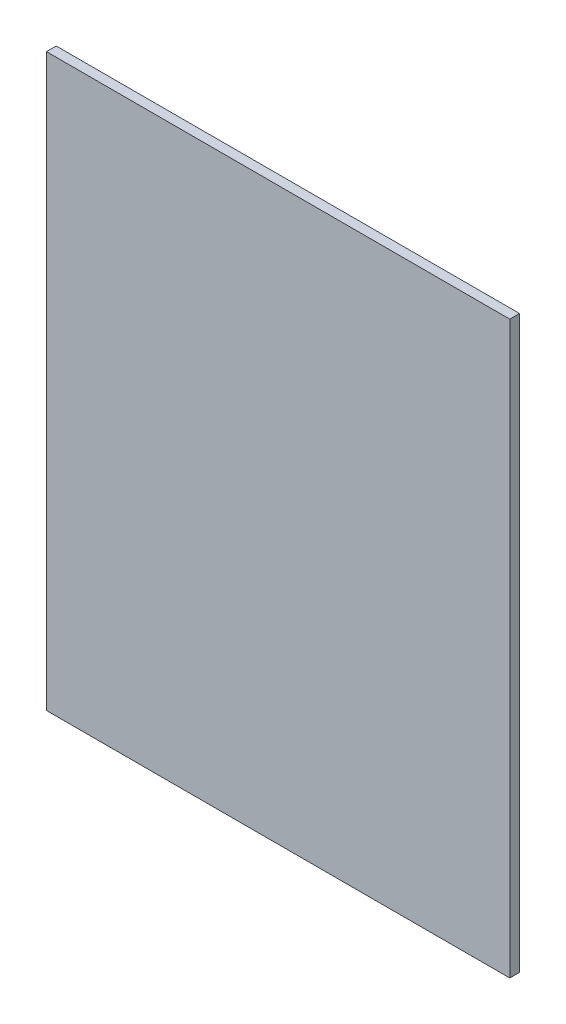
ISO-10303-21;
HEADER;
FILE_DESCRIPTION(('STEP AP214'),'2;1');
FILE_NAME('part.step','',(''),(''),'','','');
FILE_SCHEMA(('AUTOMOTIVE_DESIGN { 1 0 10303 214 1 1 1 1 }'));
ENDSEC;
DATA;
#1=APPLICATION_CONTEXT('core data for automotive mechanical design processes');
#2=APPLICATION_PROTOCOL_DEFINITION('international standard','automotive_design',2000,#1);
#3=PRODUCT_CONTEXT('',#1,'mechanical');
#4=PRODUCT('Part','Part','',(#3));
#5=PRODUCT_RELATED_PRODUCT_CATEGORY('part','',(#4));
#6=PRODUCT_DEFINITION_FORMATION('','',#4);
#7=PRODUCT_DEFINITION_CONTEXT('part definition',#1,'design');
#8=PRODUCT_DEFINITION('design','',#6,#7);
#9=PRODUCT_DEFINITION_SHAPE('','',#8);
#10=(LENGTH_UNIT() NAMED_UNIT(*) SI_UNIT(.MILLI.,.METRE.));
#11=(NAMED_UNIT(*) PLANE_ANGLE_UNIT() SI_UNIT($,.RADIAN.));
#12=(NAMED_UNIT(*) SI_UNIT($,.STERADIAN.) SOLID_ANGLE_UNIT());
#13=UNCERTAINTY_MEASURE_WITH_UNIT(LENGTH_MEASURE(1.E-05),#10,'distance_accuracy_value','');
#14=(GEOMETRIC_REPRESENTATION_CONTEXT(3) GLOBAL_UNCERTAINTY_ASSIGNED_CONTEXT((#13)) GLOBAL_UNIT_ASSIGNED_CONTEXT((#10,
#11,#12)) REPRESENTATION_CONTEXT('',''));
#15=CARTESIAN_POINT('',(0.,0.,0.));
#16=DIRECTION('',(0.,0.,1.));
#17=DIRECTION('',(1.,0.,0.));
#18=AXIS2_PLACEMENT_3D('',#15,#16,#17);
#19=CARTESIAN_POINT('',(190.,-234.,8.));
#20=DIRECTION('',(-1.,0.,0.));
#21=DIRECTION('',(0.,0.,1.));
#22=AXIS2_PLACEMENT_3D('',#19,#20,#21);
#23=PLANE('',#22);
#24=DIRECTION('',(0.,1.,0.));
#25=VECTOR('',#24,1.);
#26=CARTESIAN_POINT('',(190.,-234.,0.));
#27=LINE('',#26,#25);
#28=CARTESIAN_POINT('',(190.,-234.,0.));
#29=VERTEX_POINT('',#28);
#30=CARTESIAN_POINT('',(190.,234.,0.));
#31=VERTEX_POINT('',#30);
#32=EDGE_CURVE('E107',#29,#31,#27,.T.);
#33=ORIENTED_EDGE('',*,*,#32,.T.);
#34=DIRECTION('',(0.,0.,-1.));
#35=VECTOR('',#34,1.);
#36=CARTESIAN_POINT('',(190.,234.,8.));
#37=LINE('',#36,#35);
#38=CARTESIAN_POINT('',(190.,234.,8.));
#39=VERTEX_POINT('',#38);
#40=EDGE_CURVE('E11',#39,#31,#37,.T.);
#41=ORIENTED_EDGE('',*,*,#40,.F.);
#42=DIRECTION('',(0.,1.,0.));
#43=VECTOR('',#42,1.);
#44=CARTESIAN_POINT('',(190.,-234.,8.));
#45=LINE('',#44,#43);
#46=CARTESIAN_POINT('',(190.,-234.,8.));
#47=VERTEX_POINT('',#46);
#48=EDGE_CURVE('E90',#47,#39,#45,.T.);
#49=ORIENTED_EDGE('',*,*,#48,.F.);
#50=DIRECTION('',(0.,0.,-1.));
#51=VECTOR('',#50,1.);
#52=CARTESIAN_POINT('',(190.,-234.,8.));
#53=LINE('',#52,#51);
#54=EDGE_CURVE('E103',#47,#29,#53,.T.);
#55=ORIENTED_EDGE('',*,*,#54,.T.);
#56=EDGE_LOOP('',(#33,#41,#49,#55));
#57=FACE_BOUND('',#56,.T.);
#58=ADVANCED_FACE('F38',(#57),#23,.F.);
#59=CARTESIAN_POINT('',(-190.,234.,8.));
#60=DIRECTION('',(0.,-1.,0.));
#61=DIRECTION('',(0.,0.,-1.));
#62=AXIS2_PLACEMENT_3D('',#59,#60,#61);
#63=PLANE('',#62);
#64=DIRECTION('',(-1.,0.,0.));
#65=VECTOR('',#64,1.);
#66=CARTESIAN_POINT('',(-190.,234.,0.));
#67=LINE('',#66,#65);
#68=CARTESIAN_POINT('',(-190.,234.,0.));
#69=VERTEX_POINT('',#68);
#70=EDGE_CURVE('E95',#31,#69,#67,.T.);
#71=ORIENTED_EDGE('',*,*,#70,.T.);
#72=DIRECTION('',(0.,0.,-1.));
#73=VECTOR('',#72,1.);
#74=CARTESIAN_POINT('',(-190.,234.,8.));
#75=LINE('',#74,#73);
#76=CARTESIAN_POINT('',(-190.,234.,8.));
#77=VERTEX_POINT('',#76);
#78=EDGE_CURVE('E47',#77,#69,#75,.T.);
#79=ORIENTED_EDGE('',*,*,#78,.F.);
#80=DIRECTION('',(-1.,0.,0.));
#81=VECTOR('',#80,1.);
#82=CARTESIAN_POINT('',(-190.,234.,8.));
#83=LINE('',#82,#81);
#84=EDGE_CURVE('E85',#39,#77,#83,.T.);
#85=ORIENTED_EDGE('',*,*,#84,.F.);
#86=ORIENTED_EDGE('',*,*,#40,.T.);
#87=EDGE_LOOP('',(#71,#79,#85,#86));
#88=FACE_BOUND('',#87,.T.);
#89=ADVANCED_FACE('F94',(#88),#63,.F.);
#90=CARTESIAN_POINT('',(-190.,-234.,8.));
#91=DIRECTION('',(1.,0.,0.));
#92=DIRECTION('',(0.,0.,-1.));
#93=AXIS2_PLACEMENT_3D('',#90,#91,#92);
#94=PLANE('',#93);
#95=DIRECTION('',(0.,-1.,0.));
#96=VECTOR('',#95,1.);
#97=CARTESIAN_POINT('',(-190.,-234.,0.));
#98=LINE('',#97,#96);
#99=CARTESIAN_POINT('',(-190.,-234.,0.));
#100=VERTEX_POINT('',#99);
#101=EDGE_CURVE('E72',#69,#100,#98,.T.);
#102=ORIENTED_EDGE('',*,*,#101,.T.);
#103=DIRECTION('',(0.,0.,-1.));
#104=VECTOR('',#103,1.);
#105=CARTESIAN_POINT('',(-190.,-234.,8.));
#106=LINE('',#105,#104);
#107=CARTESIAN_POINT('',(-190.,-234.,8.));
#108=VERTEX_POINT('',#107);
#109=EDGE_CURVE('E97',#108,#100,#106,.T.);
#110=ORIENTED_EDGE('',*,*,#109,.F.);
#111=DIRECTION('',(0.,-1.,0.));
#112=VECTOR('',#111,1.);
#113=CARTESIAN_POINT('',(-190.,-234.,8.));
#114=LINE('',#113,#112);
#115=EDGE_CURVE('E88',#77,#108,#114,.T.);
#116=ORIENTED_EDGE('',*,*,#115,.F.);
#117=ORIENTED_EDGE('',*,*,#78,.T.);
#118=EDGE_LOOP('',(#102,#110,#116,#117));
#119=FACE_BOUND('',#118,.T.);
#120=ADVANCED_FACE('F98',(#119),#94,.F.);
#121=CARTESIAN_POINT('',(-190.,-234.,8.));
#122=DIRECTION('',(0.,1.,0.));
#123=DIRECTION('',(0.,0.,1.));
#124=AXIS2_PLACEMENT_3D('',#121,#122,#123);
#125=PLANE('',#124);
#126=DIRECTION('',(1.,0.,0.));
#127=VECTOR('',#126,1.);
#128=CARTESIAN_POINT('',(-190.,-234.,0.));
#129=LINE('',#128,#127);
#130=EDGE_CURVE('E78',#100,#29,#129,.T.);
#131=ORIENTED_EDGE('',*,*,#130,.T.);
#132=ORIENTED_EDGE('',*,*,#54,.F.);
#133=DIRECTION('',(1.,0.,0.));
#134=VECTOR('',#133,1.);
#135=CARTESIAN_POINT('',(-190.,-234.,8.));
#136=LINE('',#135,#134);
#137=EDGE_CURVE('E55',#108,#47,#136,.T.);
#138=ORIENTED_EDGE('',*,*,#137,.F.);
#139=ORIENTED_EDGE('',*,*,#109,.T.);
#140=EDGE_LOOP('',(#131,#132,#138,#139));
#141=FACE_BOUND('',#140,.T.);
#142=ADVANCED_FACE('F119',(#141),#125,.F.);
#143=CARTESIAN_POINT('',(0.,0.,8.));
#144=DIRECTION('',(0.,0.,-1.));
#145=DIRECTION('',(-1.,0.,0.));
#146=AXIS2_PLACEMENT_3D('',#143,#144,#145);
#147=PLANE('',#146);
#148=ORIENTED_EDGE('',*,*,#48,.T.);
#149=ORIENTED_EDGE('',*,*,#84,.T.);
#150=ORIENTED_EDGE('',*,*,#115,.T.);
#151=ORIENTED_EDGE('',*,*,#137,.T.);
#152=EDGE_LOOP('',(#148,#149,#150,#151));
#153=FACE_BOUND('',#152,.T.);
#154=ADVANCED_FACE('F86',(#153),#147,.F.);
#155=CARTESIAN_POINT('',(0.,0.,0.));
#156=DIRECTION('',(0.,0.,-1.));
#157=DIRECTION('',(-1.,0.,0.));
#158=AXIS2_PLACEMENT_3D('',#155,#156,#157);
#159=PLANE('',#158);
#160=ORIENTED_EDGE('',*,*,#32,.F.);
#161=ORIENTED_EDGE('',*,*,#130,.F.);
#162=ORIENTED_EDGE('',*,*,#101,.F.);
#163=ORIENTED_EDGE('',*,*,#70,.F.);
#164=EDGE_LOOP('',(#160,#161,#162,#163));
#165=FACE_BOUND('',#164,.T.);
#166=ADVANCED_FACE('F122',(#165),#159,.T.);
#167=CLOSED_SHELL('',(#58,#89,#120,#142,#154,#166));
#168=MANIFOLD_SOLID_BREP('B2',#167);
#169=ADVANCED_BREP_SHAPE_REPRESENTATION('',(#18,#168),#14);
#170=SHAPE_DEFINITION_REPRESENTATION(#9,#169);
ENDSEC;
END-ISO-10303-21;
